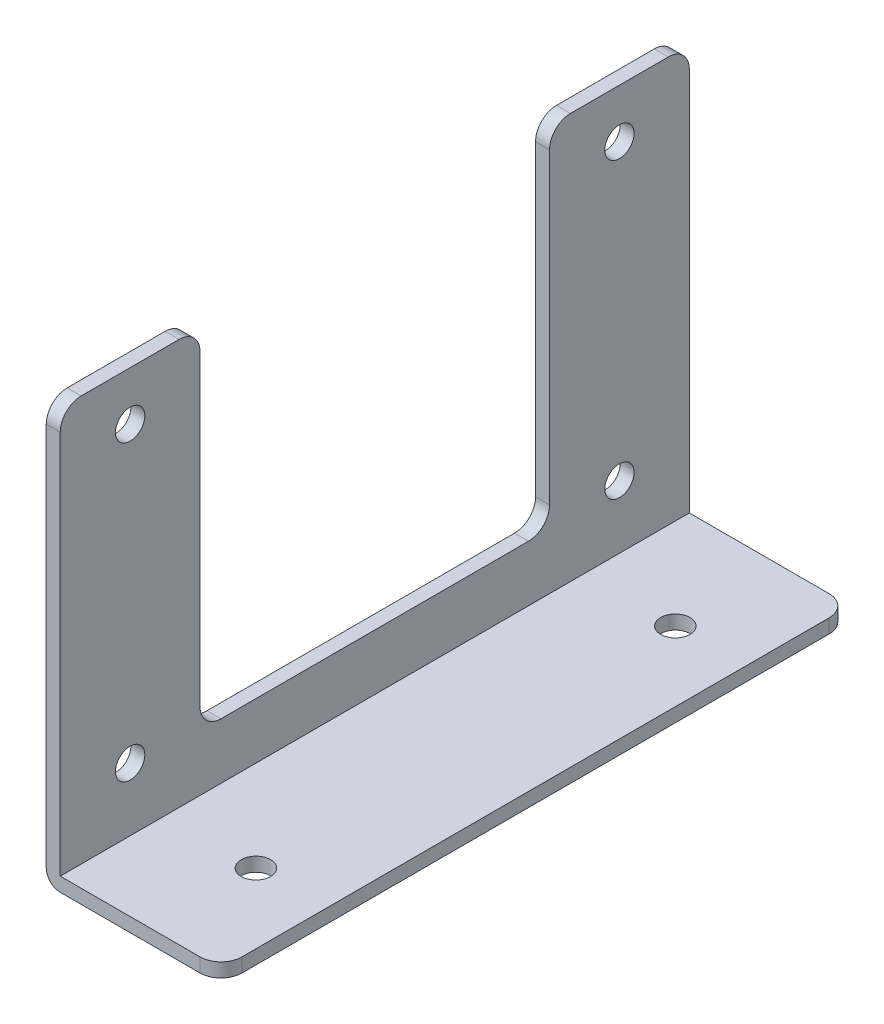
ISO-10303-21;
HEADER;
FILE_DESCRIPTION(('STEP AP214'),'2;1');
FILE_NAME('part.step','',(''),(''),'','','');
FILE_SCHEMA(('AUTOMOTIVE_DESIGN { 1 0 10303 214 1 1 1 1 }'));
ENDSEC;
DATA;
#1=APPLICATION_CONTEXT('core data for automotive mechanical design processes');
#2=APPLICATION_PROTOCOL_DEFINITION('international standard','automotive_design',2000,#1);
#3=PRODUCT_CONTEXT('',#1,'mechanical');
#4=PRODUCT('Part','Part','',(#3));
#5=PRODUCT_RELATED_PRODUCT_CATEGORY('part','',(#4));
#6=PRODUCT_DEFINITION_FORMATION('','',#4);
#7=PRODUCT_DEFINITION_CONTEXT('part definition',#1,'design');
#8=PRODUCT_DEFINITION('design','',#6,#7);
#9=PRODUCT_DEFINITION_SHAPE('','',#8);
#10=(LENGTH_UNIT() NAMED_UNIT(*) SI_UNIT(.MILLI.,.METRE.));
#11=(NAMED_UNIT(*) PLANE_ANGLE_UNIT() SI_UNIT($,.RADIAN.));
#12=(NAMED_UNIT(*) SI_UNIT($,.STERADIAN.) SOLID_ANGLE_UNIT());
#13=UNCERTAINTY_MEASURE_WITH_UNIT(LENGTH_MEASURE(1.E-05),#10,'distance_accuracy_value','');
#14=(GEOMETRIC_REPRESENTATION_CONTEXT(3) GLOBAL_UNCERTAINTY_ASSIGNED_CONTEXT((#13)) GLOBAL_UNIT_ASSIGNED_CONTEXT((#10,
#11,#12)) REPRESENTATION_CONTEXT('',''));
#15=CARTESIAN_POINT('',(0.,0.,0.));
#16=DIRECTION('',(0.,0.,1.));
#17=DIRECTION('',(1.,0.,0.));
#18=AXIS2_PLACEMENT_3D('',#15,#16,#17);
#19=CARTESIAN_POINT('',(0.,-39.531388125356,45.));
#20=DIRECTION('',(1.,0.,0.));
#21=DIRECTION('',(0.,1.,0.));
#22=AXIS2_PLACEMENT_3D('',#19,#20,#21);
#23=PLANE('',#22);
#24=CARTESIAN_POINT('',(0.,-88.531388125356,35.));
#25=DIRECTION('',(1.,0.,0.));
#26=DIRECTION('',(0.,0.,-1.));
#27=AXIS2_PLACEMENT_3D('',#24,#25,#26);
#28=CIRCLE('',#27,2.1);
#29=CARTESIAN_POINT('',(0.,-88.531388125356,32.9));
#30=VERTEX_POINT('',#29);
#31=EDGE_CURVE('E204',#30,#30,#28,.T.);
#32=ORIENTED_EDGE('',*,*,#31,.T.);
#33=EDGE_LOOP('',(#32));
#34=FACE_BOUND('',#33,.T.);
#35=CARTESIAN_POINT('',(0.,-46.531388125356,35.));
#36=DIRECTION('',(1.,0.,0.));
#37=DIRECTION('',(0.,0.,-1.));
#38=AXIS2_PLACEMENT_3D('',#35,#36,#37);
#39=CIRCLE('',#38,2.1);
#40=CARTESIAN_POINT('',(0.,-46.531388125356,32.9));
#41=VERTEX_POINT('',#40);
#42=EDGE_CURVE('E459',#41,#41,#39,.T.);
#43=ORIENTED_EDGE('',*,*,#42,.T.);
#44=EDGE_LOOP('',(#43));
#45=FACE_BOUND('',#44,.T.);
#46=CARTESIAN_POINT('',(0.,-88.531388125356,-35.));
#47=DIRECTION('',(1.,0.,0.));
#48=DIRECTION('',(0.,0.,1.));
#49=AXIS2_PLACEMENT_3D('',#46,#47,#48);
#50=CIRCLE('',#49,2.1);
#51=CARTESIAN_POINT('',(0.,-88.531388125356,-32.9));
#52=VERTEX_POINT('',#51);
#53=EDGE_CURVE('E462',#52,#52,#50,.T.);
#54=ORIENTED_EDGE('',*,*,#53,.T.);
#55=EDGE_LOOP('',(#54));
#56=FACE_BOUND('',#55,.T.);
#57=CARTESIAN_POINT('',(0.,-46.531388125356,-35.));
#58=DIRECTION('',(1.,0.,0.));
#59=DIRECTION('',(0.,0.,1.));
#60=AXIS2_PLACEMENT_3D('',#57,#58,#59);
#61=CIRCLE('',#60,2.1);
#62=CARTESIAN_POINT('',(0.,-46.531388125356,-32.9));
#63=VERTEX_POINT('',#62);
#64=EDGE_CURVE('E217',#63,#63,#61,.T.);
#65=ORIENTED_EDGE('',*,*,#64,.T.);
#66=EDGE_LOOP('',(#65));
#67=FACE_BOUND('',#66,.T.);
#68=DIRECTION('',(0.,1.,0.));
#69=VECTOR('',#68,1.);
#70=CARTESIAN_POINT('',(0.,-39.531388125356,-25.));
#71=LINE('',#70,#69);
#72=CARTESIAN_POINT('',(0.,-86.531388125356,-25.));
#73=VERTEX_POINT('',#72);
#74=CARTESIAN_POINT('',(0.,-42.531388125356,-25.));
#75=VERTEX_POINT('',#74);
#76=EDGE_CURVE('E287',#73,#75,#71,.T.);
#77=ORIENTED_EDGE('',*,*,#76,.T.);
#78=CARTESIAN_POINT('',(0.,-42.531388125356,-28.));
#79=DIRECTION('',(1.,0.,0.));
#80=DIRECTION('',(0.,1.,0.));
#81=AXIS2_PLACEMENT_3D('',#78,#79,#80);
#82=CIRCLE('',#81,3.);
#83=CARTESIAN_POINT('',(0.,-39.531388125356,-28.));
#84=VERTEX_POINT('',#83);
#85=EDGE_CURVE('E233',#75,#84,#82,.F.);
#86=ORIENTED_EDGE('',*,*,#85,.T.);
#87=DIRECTION('',(0.,0.,-1.));
#88=VECTOR('',#87,1.);
#89=CARTESIAN_POINT('',(0.,-39.531388125356,45.));
#90=LINE('',#89,#88);
#91=CARTESIAN_POINT('',(0.,-39.531388125356,-42.));
#92=VERTEX_POINT('',#91);
#93=EDGE_CURVE('E330',#84,#92,#90,.T.);
#94=ORIENTED_EDGE('',*,*,#93,.T.);
#95=CARTESIAN_POINT('',(0.,-42.531388125356,-42.));
#96=DIRECTION('',(1.,0.,0.));
#97=DIRECTION('',(0.,1.,0.));
#98=AXIS2_PLACEMENT_3D('',#95,#96,#97);
#99=CIRCLE('',#98,3.);
#100=CARTESIAN_POINT('',(0.,-42.531388125356,-45.));
#101=VERTEX_POINT('',#100);
#102=EDGE_CURVE('E229',#92,#101,#99,.F.);
#103=ORIENTED_EDGE('',*,*,#102,.T.);
#104=DIRECTION('',(0.,-1.,0.));
#105=VECTOR('',#104,1.);
#106=CARTESIAN_POINT('',(0.,-39.531388125356,-45.));
#107=LINE('',#106,#105);
#108=CARTESIAN_POINT('',(0.,-97.531388125356,-45.));
#109=VERTEX_POINT('',#108);
#110=EDGE_CURVE('E189',#101,#109,#107,.T.);
#111=ORIENTED_EDGE('',*,*,#110,.T.);
#112=DIRECTION('',(0.,0.,-1.));
#113=VECTOR('',#112,1.);
#114=CARTESIAN_POINT('',(0.,-97.531388125356,45.));
#115=LINE('',#114,#113);
#116=CARTESIAN_POINT('',(0.,-97.531388125356,45.));
#117=VERTEX_POINT('',#116);
#118=EDGE_CURVE('E182',#117,#109,#115,.T.);
#119=ORIENTED_EDGE('',*,*,#118,.F.);
#120=DIRECTION('',(0.,-1.,0.));
#121=VECTOR('',#120,1.);
#122=CARTESIAN_POINT('',(0.,-39.531388125356,45.));
#123=LINE('',#122,#121);
#124=CARTESIAN_POINT('',(0.,-42.531388125356,45.));
#125=VERTEX_POINT('',#124);
#126=EDGE_CURVE('E167',#125,#117,#123,.T.);
#127=ORIENTED_EDGE('',*,*,#126,.F.);
#128=CARTESIAN_POINT('',(0.,-42.531388125356,42.));
#129=DIRECTION('',(1.,0.,0.));
#130=DIRECTION('',(0.,1.,0.));
#131=AXIS2_PLACEMENT_3D('',#128,#129,#130);
#132=CIRCLE('',#131,3.);
#133=CARTESIAN_POINT('',(0.,-39.531388125356,42.));
#134=VERTEX_POINT('',#133);
#135=EDGE_CURVE('E227',#125,#134,#132,.F.);
#136=ORIENTED_EDGE('',*,*,#135,.T.);
#137=CARTESIAN_POINT('',(0.,-39.531388125356,28.));
#138=VERTEX_POINT('',#137);
#139=EDGE_CURVE('E339',#134,#138,#90,.T.);
#140=ORIENTED_EDGE('',*,*,#139,.T.);
#141=CARTESIAN_POINT('',(0.,-42.531388125356,28.));
#142=DIRECTION('',(1.,0.,0.));
#143=DIRECTION('',(0.,1.,0.));
#144=AXIS2_PLACEMENT_3D('',#141,#142,#143);
#145=CIRCLE('',#144,3.);
#146=CARTESIAN_POINT('',(0.,-42.531388125356,25.));
#147=VERTEX_POINT('',#146);
#148=EDGE_CURVE('E231',#138,#147,#145,.F.);
#149=ORIENTED_EDGE('',*,*,#148,.T.);
#150=DIRECTION('',(0.,-1.,0.));
#151=VECTOR('',#150,1.);
#152=CARTESIAN_POINT('',(0.,-39.531388125356,25.));
#153=LINE('',#152,#151);
#154=CARTESIAN_POINT('',(0.,-86.531388125356,25.));
#155=VERTEX_POINT('',#154);
#156=EDGE_CURVE('E213',#147,#155,#153,.T.);
#157=ORIENTED_EDGE('',*,*,#156,.T.);
#158=CARTESIAN_POINT('',(0.,-86.531388125356,22.));
#159=DIRECTION('',(1.,0.,0.));
#160=DIRECTION('',(0.,1.,0.));
#161=AXIS2_PLACEMENT_3D('',#158,#159,#160);
#162=CIRCLE('',#161,3.);
#163=CARTESIAN_POINT('',(0.,-89.531388125356,22.));
#164=VERTEX_POINT('',#163);
#165=EDGE_CURVE('E282',#155,#164,#162,.T.);
#166=ORIENTED_EDGE('',*,*,#165,.T.);
#167=DIRECTION('',(0.,0.,-1.));
#168=VECTOR('',#167,1.);
#169=CARTESIAN_POINT('',(0.,-89.531388125356,25.));
#170=LINE('',#169,#168);
#171=CARTESIAN_POINT('',(0.,-89.531388125356,-22.));
#172=VERTEX_POINT('',#171);
#173=EDGE_CURVE('E289',#164,#172,#170,.T.);
#174=ORIENTED_EDGE('',*,*,#173,.T.);
#175=CARTESIAN_POINT('',(0.,-86.531388125356,-22.));
#176=DIRECTION('',(1.,0.,0.));
#177=DIRECTION('',(0.,1.,0.));
#178=AXIS2_PLACEMENT_3D('',#175,#176,#177);
#179=CIRCLE('',#178,3.);
#180=EDGE_CURVE('E41',#172,#73,#179,.T.);
#181=ORIENTED_EDGE('',*,*,#180,.T.);
#182=EDGE_LOOP('',(#77,#86,#94,#103,#111,#119,#127,#136,#140,#149,#157,#166,#174,#181));
#183=FACE_BOUND('',#182,.T.);
#184=ADVANCED_FACE('F33',(#34,#45,#56,#67,#183),#23,.F.);
#185=CARTESIAN_POINT('',(2.,-39.531388125356,45.));
#186=DIRECTION('',(-1.,0.,0.));
#187=DIRECTION('',(0.,-1.,0.));
#188=AXIS2_PLACEMENT_3D('',#185,#186,#187);
#189=PLANE('',#188);
#190=CARTESIAN_POINT('',(2.,-88.531388125356,35.));
#191=DIRECTION('',(-1.,0.,0.));
#192=DIRECTION('',(0.,-1.,0.));
#193=AXIS2_PLACEMENT_3D('',#190,#191,#192);
#194=CIRCLE('',#193,2.1);
#195=CARTESIAN_POINT('',(2.,-90.631388125356,35.));
#196=VERTEX_POINT('',#195);
#197=EDGE_CURVE('E210',#196,#196,#194,.F.);
#198=ORIENTED_EDGE('',*,*,#197,.F.);
#199=EDGE_LOOP('',(#198));
#200=FACE_BOUND('',#199,.T.);
#201=CARTESIAN_POINT('',(1.99999999999999,-46.531388125356,35.));
#202=DIRECTION('',(-1.,0.,0.));
#203=DIRECTION('',(0.,-1.,0.));
#204=AXIS2_PLACEMENT_3D('',#201,#202,#203);
#205=CIRCLE('',#204,2.1);
#206=CARTESIAN_POINT('',(2.,-48.631388125356,35.));
#207=VERTEX_POINT('',#206);
#208=EDGE_CURVE('E207',#207,#207,#205,.F.);
#209=ORIENTED_EDGE('',*,*,#208,.F.);
#210=EDGE_LOOP('',(#209));
#211=FACE_BOUND('',#210,.T.);
#212=CARTESIAN_POINT('',(2.,-88.531388125356,-35.));
#213=DIRECTION('',(-1.,0.,0.));
#214=DIRECTION('',(0.,-1.,0.));
#215=AXIS2_PLACEMENT_3D('',#212,#213,#214);
#216=CIRCLE('',#215,2.1);
#217=CARTESIAN_POINT('',(2.,-90.631388125356,-35.));
#218=VERTEX_POINT('',#217);
#219=EDGE_CURVE('E203',#218,#218,#216,.F.);
#220=ORIENTED_EDGE('',*,*,#219,.F.);
#221=EDGE_LOOP('',(#220));
#222=FACE_BOUND('',#221,.T.);
#223=CARTESIAN_POINT('',(1.99999999999999,-46.531388125356,-35.));
#224=DIRECTION('',(-1.,0.,0.));
#225=DIRECTION('',(0.,-1.,0.));
#226=AXIS2_PLACEMENT_3D('',#223,#224,#225);
#227=CIRCLE('',#226,2.1);
#228=CARTESIAN_POINT('',(2.,-48.631388125356,-35.));
#229=VERTEX_POINT('',#228);
#230=EDGE_CURVE('E200',#229,#229,#227,.F.);
#231=ORIENTED_EDGE('',*,*,#230,.F.);
#232=EDGE_LOOP('',(#231));
#233=FACE_BOUND('',#232,.T.);
#234=DIRECTION('',(0.,0.,-1.));
#235=VECTOR('',#234,1.);
#236=CARTESIAN_POINT('',(2.,-39.531388125356,45.));
#237=LINE('',#236,#235);
#238=CARTESIAN_POINT('',(2.,-39.531388125356,-28.));
#239=VERTEX_POINT('',#238);
#240=CARTESIAN_POINT('',(2.,-39.531388125356,-42.));
#241=VERTEX_POINT('',#240);
#242=EDGE_CURVE('E342',#239,#241,#237,.T.);
#243=ORIENTED_EDGE('',*,*,#242,.F.);
#244=CARTESIAN_POINT('',(1.99999999999999,-42.531388125356,-28.));
#245=DIRECTION('',(-1.,0.,0.));
#246=DIRECTION('',(0.,-1.,0.));
#247=AXIS2_PLACEMENT_3D('',#244,#245,#246);
#248=CIRCLE('',#247,3.);
#249=CARTESIAN_POINT('',(2.,-42.531388125356,-25.));
#250=VERTEX_POINT('',#249);
#251=EDGE_CURVE('E246',#239,#250,#248,.F.);
#252=ORIENTED_EDGE('',*,*,#251,.T.);
#253=DIRECTION('',(0.,1.,0.));
#254=VECTOR('',#253,1.);
#255=CARTESIAN_POINT('',(2.,-39.531388125356,-25.));
#256=LINE('',#255,#254);
#257=CARTESIAN_POINT('',(2.,-86.531388125356,-25.));
#258=VERTEX_POINT('',#257);
#259=EDGE_CURVE('E298',#258,#250,#256,.T.);
#260=ORIENTED_EDGE('',*,*,#259,.F.);
#261=CARTESIAN_POINT('',(2.,-86.531388125356,-22.));
#262=DIRECTION('',(-1.,0.,0.));
#263=DIRECTION('',(0.,-1.,0.));
#264=AXIS2_PLACEMENT_3D('',#261,#262,#263);
#265=CIRCLE('',#264,3.);
#266=CARTESIAN_POINT('',(2.,-89.531388125356,-22.));
#267=VERTEX_POINT('',#266);
#268=EDGE_CURVE('E11',#258,#267,#265,.T.);
#269=ORIENTED_EDGE('',*,*,#268,.T.);
#270=DIRECTION('',(0.,0.,-1.));
#271=VECTOR('',#270,1.);
#272=CARTESIAN_POINT('',(2.,-89.531388125356,45.));
#273=LINE('',#272,#271);
#274=CARTESIAN_POINT('',(2.,-89.531388125356,22.));
#275=VERTEX_POINT('',#274);
#276=EDGE_CURVE('E191',#275,#267,#273,.T.);
#277=ORIENTED_EDGE('',*,*,#276,.F.);
#278=CARTESIAN_POINT('',(2.,-86.531388125356,22.));
#279=DIRECTION('',(-1.,0.,0.));
#280=DIRECTION('',(0.,-1.,0.));
#281=AXIS2_PLACEMENT_3D('',#278,#279,#280);
#282=CIRCLE('',#281,3.);
#283=CARTESIAN_POINT('',(2.,-86.531388125356,25.));
#284=VERTEX_POINT('',#283);
#285=EDGE_CURVE('E284',#275,#284,#282,.T.);
#286=ORIENTED_EDGE('',*,*,#285,.T.);
#287=DIRECTION('',(0.,-1.,0.));
#288=VECTOR('',#287,1.);
#289=CARTESIAN_POINT('',(2.,-39.531388125356,25.));
#290=LINE('',#289,#288);
#291=CARTESIAN_POINT('',(2.,-42.531388125356,25.));
#292=VERTEX_POINT('',#291);
#293=EDGE_CURVE('E315',#292,#284,#290,.T.);
#294=ORIENTED_EDGE('',*,*,#293,.F.);
#295=CARTESIAN_POINT('',(1.99999999999999,-42.531388125356,28.));
#296=DIRECTION('',(-1.,0.,0.));
#297=DIRECTION('',(0.,-1.,0.));
#298=AXIS2_PLACEMENT_3D('',#295,#296,#297);
#299=CIRCLE('',#298,3.);
#300=CARTESIAN_POINT('',(2.,-39.531388125356,28.));
#301=VERTEX_POINT('',#300);
#302=EDGE_CURVE('E244',#292,#301,#299,.F.);
#303=ORIENTED_EDGE('',*,*,#302,.T.);
#304=CARTESIAN_POINT('',(2.,-39.531388125356,42.));
#305=VERTEX_POINT('',#304);
#306=EDGE_CURVE('E343',#305,#301,#237,.T.);
#307=ORIENTED_EDGE('',*,*,#306,.F.);
#308=CARTESIAN_POINT('',(2.,-42.531388125356,42.));
#309=DIRECTION('',(-1.,0.,0.));
#310=DIRECTION('',(0.,-1.,0.));
#311=AXIS2_PLACEMENT_3D('',#308,#309,#310);
#312=CIRCLE('',#311,3.);
#313=CARTESIAN_POINT('',(2.,-42.531388125356,45.));
#314=VERTEX_POINT('',#313);
#315=EDGE_CURVE('E240',#305,#314,#312,.F.);
#316=ORIENTED_EDGE('',*,*,#315,.T.);
#317=DIRECTION('',(0.,1.,0.));
#318=VECTOR('',#317,1.);
#319=CARTESIAN_POINT('',(2.,-39.531388125356,45.));
#320=LINE('',#319,#318);
#321=CARTESIAN_POINT('',(2.,-97.531388125356,45.));
#322=VERTEX_POINT('',#321);
#323=EDGE_CURVE('E329',#322,#314,#320,.T.);
#324=ORIENTED_EDGE('',*,*,#323,.F.);
#325=DIRECTION('',(0.,0.,-1.));
#326=VECTOR('',#325,1.);
#327=CARTESIAN_POINT('',(2.,-97.531388125356,45.));
#328=LINE('',#327,#326);
#329=CARTESIAN_POINT('',(2.,-97.531388125356,-45.));
#330=VERTEX_POINT('',#329);
#331=EDGE_CURVE('E346',#322,#330,#328,.T.);
#332=ORIENTED_EDGE('',*,*,#331,.T.);
#333=DIRECTION('',(0.,1.,0.));
#334=VECTOR('',#333,1.);
#335=CARTESIAN_POINT('',(2.,-39.531388125356,-45.));
#336=LINE('',#335,#334);
#337=CARTESIAN_POINT('',(2.,-42.531388125356,-45.));
#338=VERTEX_POINT('',#337);
#339=EDGE_CURVE('E177',#330,#338,#336,.T.);
#340=ORIENTED_EDGE('',*,*,#339,.T.);
#341=CARTESIAN_POINT('',(2.,-42.531388125356,-42.));
#342=DIRECTION('',(-1.,0.,0.));
#343=DIRECTION('',(0.,-1.,0.));
#344=AXIS2_PLACEMENT_3D('',#341,#342,#343);
#345=CIRCLE('',#344,3.);
#346=EDGE_CURVE('E242',#338,#241,#345,.F.);
#347=ORIENTED_EDGE('',*,*,#346,.T.);
#348=EDGE_LOOP('',(#243,#252,#260,#269,#277,#286,#294,#303,#307,#316,#324,#332,#340,#347));
#349=FACE_BOUND('',#348,.T.);
#350=ADVANCED_FACE('F305',(#200,#211,#222,#233,#349),#189,.F.);
#351=CARTESIAN_POINT('',(0.,-39.531388125356,45.));
#352=DIRECTION('',(0.,-1.,0.));
#353=DIRECTION('',(0.,0.,-1.));
#354=AXIS2_PLACEMENT_3D('',#351,#352,#353);
#355=PLANE('',#354);
#356=ORIENTED_EDGE('',*,*,#306,.T.);
#357=DIRECTION('',(1.,0.,0.));
#358=VECTOR('',#357,1.);
#359=CARTESIAN_POINT('',(0.,-39.531388125356,28.));
#360=LINE('',#359,#358);
#361=EDGE_CURVE('E256',#301,#138,#360,.F.);
#362=ORIENTED_EDGE('',*,*,#361,.T.);
#363=ORIENTED_EDGE('',*,*,#139,.F.);
#364=DIRECTION('',(-1.,0.,0.));
#365=VECTOR('',#364,1.);
#366=CARTESIAN_POINT('',(2.,-39.531388125356,42.));
#367=LINE('',#366,#365);
#368=EDGE_CURVE('E254',#134,#305,#367,.F.);
#369=ORIENTED_EDGE('',*,*,#368,.T.);
#370=EDGE_LOOP('',(#356,#362,#363,#369));
#371=FACE_BOUND('',#370,.T.);
#372=ADVANCED_FACE('F399',(#371),#355,.F.);
#373=ORIENTED_EDGE('',*,*,#93,.F.);
#374=DIRECTION('',(-1.,0.,0.));
#375=VECTOR('',#374,1.);
#376=CARTESIAN_POINT('',(1.99999999999999,-39.531388125356,-28.));
#377=LINE('',#376,#375);
#378=EDGE_CURVE('E238',#84,#239,#377,.F.);
#379=ORIENTED_EDGE('',*,*,#378,.T.);
#380=ORIENTED_EDGE('',*,*,#242,.T.);
#381=DIRECTION('',(-1.,0.,0.));
#382=VECTOR('',#381,1.);
#383=CARTESIAN_POINT('',(0.,-39.531388125356,-42.));
#384=LINE('',#383,#382);
#385=EDGE_CURVE('E235',#241,#92,#384,.T.);
#386=ORIENTED_EDGE('',*,*,#385,.T.);
#387=EDGE_LOOP('',(#373,#379,#380,#386));
#388=FACE_BOUND('',#387,.T.);
#389=ADVANCED_FACE('F375',(#388),#355,.F.);
#390=CARTESIAN_POINT('',(2.,-97.531388125356,45.));
#391=DIRECTION('',(0.,0.,-1.));
#392=DIRECTION('',(-1.,0.,0.));
#393=AXIS2_PLACEMENT_3D('',#390,#391,#392);
#394=CYLINDRICAL_SURFACE('',#393,2.);
#395=CARTESIAN_POINT('',(2.,-97.531388125356,-45.));
#396=DIRECTION('',(0.,0.,1.));
#397=DIRECTION('',(1.,0.,0.));
#398=AXIS2_PLACEMENT_3D('',#395,#396,#397);
#399=CIRCLE('',#398,2.);
#400=CARTESIAN_POINT('',(2.00000000000002,-99.531388125356,-45.));
#401=VERTEX_POINT('',#400);
#402=EDGE_CURVE('E322',#109,#401,#399,.T.);
#403=ORIENTED_EDGE('',*,*,#402,.T.);
#404=DIRECTION('',(0.,0.,-1.));
#405=VECTOR('',#404,1.);
#406=CARTESIAN_POINT('',(2.00000000000002,-99.531388125356,45.));
#407=LINE('',#406,#405);
#408=CARTESIAN_POINT('',(2.00000000000002,-99.531388125356,45.));
#409=VERTEX_POINT('',#408);
#410=EDGE_CURVE('E184',#409,#401,#407,.T.);
#411=ORIENTED_EDGE('',*,*,#410,.F.);
#412=CARTESIAN_POINT('',(2.,-97.531388125356,45.));
#413=DIRECTION('',(0.,0.,1.));
#414=DIRECTION('',(1.,0.,0.));
#415=AXIS2_PLACEMENT_3D('',#412,#413,#414);
#416=CIRCLE('',#415,2.);
#417=EDGE_CURVE('E171',#117,#409,#416,.T.);
#418=ORIENTED_EDGE('',*,*,#417,.F.);
#419=ORIENTED_EDGE('',*,*,#118,.T.);
#420=EDGE_LOOP('',(#403,#411,#418,#419));
#421=FACE_BOUND('',#420,.T.);
#422=ADVANCED_FACE('F181',(#421),#394,.T.);
#423=CARTESIAN_POINT('',(2.00000000000002,-99.531388125356,45.));
#424=DIRECTION('',(0.,1.,0.));
#425=DIRECTION('',(0.,0.,1.));
#426=AXIS2_PLACEMENT_3D('',#423,#424,#425);
#427=PLANE('',#426);
#428=CARTESIAN_POINT('',(15.,-99.531388125356,30.));
#429=DIRECTION('',(0.,1.,0.));
#430=DIRECTION('',(0.,0.,1.));
#431=AXIS2_PLACEMENT_3D('',#428,#429,#430);
#432=CIRCLE('',#431,2.1);
#433=CARTESIAN_POINT('',(15.,-99.531388125356,32.1));
#434=VERTEX_POINT('',#433);
#435=EDGE_CURVE('E222',#434,#434,#432,.T.);
#436=ORIENTED_EDGE('',*,*,#435,.T.);
#437=EDGE_LOOP('',(#436));
#438=FACE_BOUND('',#437,.T.);
#439=CARTESIAN_POINT('',(15.,-99.531388125356,-30.));
#440=DIRECTION('',(0.,1.,0.));
#441=DIRECTION('',(0.,0.,1.));
#442=AXIS2_PLACEMENT_3D('',#439,#440,#441);
#443=CIRCLE('',#442,2.1);
#444=CARTESIAN_POINT('',(15.,-99.531388125356,-27.9));
#445=VERTEX_POINT('',#444);
#446=EDGE_CURVE('E218',#445,#445,#443,.T.);
#447=ORIENTED_EDGE('',*,*,#446,.T.);
#448=EDGE_LOOP('',(#447));
#449=FACE_BOUND('',#448,.T.);
#450=DIRECTION('',(1.,0.,0.));
#451=VECTOR('',#450,1.);
#452=CARTESIAN_POINT('',(2.00000000000002,-99.531388125356,-45.));
#453=LINE('',#452,#451);
#454=CARTESIAN_POINT('',(22.,-99.531388125356,-45.));
#455=VERTEX_POINT('',#454);
#456=EDGE_CURVE('E333',#401,#455,#453,.T.);
#457=ORIENTED_EDGE('',*,*,#456,.T.);
#458=CARTESIAN_POINT('',(22.,-99.531388125356,-42.));
#459=DIRECTION('',(0.,1.,0.));
#460=DIRECTION('',(0.,0.,1.));
#461=AXIS2_PLACEMENT_3D('',#458,#459,#460);
#462=CIRCLE('',#461,3.);
#463=CARTESIAN_POINT('',(25.,-99.531388125356,-42.));
#464=VERTEX_POINT('',#463);
#465=EDGE_CURVE('E276',#455,#464,#462,.F.);
#466=ORIENTED_EDGE('',*,*,#465,.T.);
#467=DIRECTION('',(0.,0.,-1.));
#468=VECTOR('',#467,1.);
#469=CARTESIAN_POINT('',(25.,-99.531388125356,45.));
#470=LINE('',#469,#468);
#471=CARTESIAN_POINT('',(25.,-99.531388125356,42.));
#472=VERTEX_POINT('',#471);
#473=EDGE_CURVE('E196',#472,#464,#470,.T.);
#474=ORIENTED_EDGE('',*,*,#473,.F.);
#475=CARTESIAN_POINT('',(22.,-99.531388125356,42.));
#476=DIRECTION('',(0.,1.,0.));
#477=DIRECTION('',(0.,0.,1.));
#478=AXIS2_PLACEMENT_3D('',#475,#476,#477);
#479=CIRCLE('',#478,3.);
#480=CARTESIAN_POINT('',(22.,-99.531388125356,45.));
#481=VERTEX_POINT('',#480);
#482=EDGE_CURVE('E48',#472,#481,#479,.F.);
#483=ORIENTED_EDGE('',*,*,#482,.T.);
#484=DIRECTION('',(1.,0.,0.));
#485=VECTOR('',#484,1.);
#486=CARTESIAN_POINT('',(2.00000000000002,-99.531388125356,45.));
#487=LINE('',#486,#485);
#488=EDGE_CURVE('E185',#409,#481,#487,.T.);
#489=ORIENTED_EDGE('',*,*,#488,.F.);
#490=ORIENTED_EDGE('',*,*,#410,.T.);
#491=EDGE_LOOP('',(#457,#466,#474,#483,#489,#490));
#492=FACE_BOUND('',#491,.T.);
#493=ADVANCED_FACE('F407',(#438,#449,#492),#427,.F.);
#494=CARTESIAN_POINT('',(25.,-97.531388125356,45.));
#495=DIRECTION('',(-1.,0.,0.));
#496=DIRECTION('',(0.,-1.,0.));
#497=AXIS2_PLACEMENT_3D('',#494,#495,#496);
#498=PLANE('',#497);
#499=ORIENTED_EDGE('',*,*,#473,.T.);
#500=DIRECTION('',(0.,1.,0.));
#501=VECTOR('',#500,1.);
#502=CARTESIAN_POINT('',(25.,-97.531388125356,-42.));
#503=LINE('',#502,#501);
#504=CARTESIAN_POINT('',(25.,-97.531388125356,-42.));
#505=VERTEX_POINT('',#504);
#506=EDGE_CURVE('E265',#464,#505,#503,.T.);
#507=ORIENTED_EDGE('',*,*,#506,.T.);
#508=DIRECTION('',(0.,0.,-1.));
#509=VECTOR('',#508,1.);
#510=CARTESIAN_POINT('',(25.,-97.531388125356,45.));
#511=LINE('',#510,#509);
#512=CARTESIAN_POINT('',(25.,-97.531388125356,42.));
#513=VERTEX_POINT('',#512);
#514=EDGE_CURVE('E349',#513,#505,#511,.T.);
#515=ORIENTED_EDGE('',*,*,#514,.F.);
#516=DIRECTION('',(0.,1.,0.));
#517=VECTOR('',#516,1.);
#518=CARTESIAN_POINT('',(25.,-99.531388125356,42.));
#519=LINE('',#518,#517);
#520=EDGE_CURVE('E263',#513,#472,#519,.F.);
#521=ORIENTED_EDGE('',*,*,#520,.T.);
#522=EDGE_LOOP('',(#499,#507,#515,#521));
#523=FACE_BOUND('',#522,.T.);
#524=ADVANCED_FACE('F354',(#523),#498,.F.);
#525=CARTESIAN_POINT('',(2.,-97.531388125356,45.));
#526=DIRECTION('',(0.,-1.,0.));
#527=DIRECTION('',(0.,0.,-1.));
#528=AXIS2_PLACEMENT_3D('',#525,#526,#527);
#529=PLANE('',#528);
#530=CARTESIAN_POINT('',(15.,-97.531388125356,30.));
#531=DIRECTION('',(0.,-1.,0.));
#532=DIRECTION('',(0.,0.,-1.));
#533=AXIS2_PLACEMENT_3D('',#530,#531,#532);
#534=CIRCLE('',#533,2.1);
#535=CARTESIAN_POINT('',(15.,-97.531388125356,27.9));
#536=VERTEX_POINT('',#535);
#537=EDGE_CURVE('E219',#536,#536,#534,.T.);
#538=ORIENTED_EDGE('',*,*,#537,.T.);
#539=EDGE_LOOP('',(#538));
#540=FACE_BOUND('',#539,.T.);
#541=CARTESIAN_POINT('',(15.,-97.531388125356,-30.));
#542=DIRECTION('',(0.,-1.,0.));
#543=DIRECTION('',(0.,0.,-1.));
#544=AXIS2_PLACEMENT_3D('',#541,#542,#543);
#545=CIRCLE('',#544,2.1);
#546=CARTESIAN_POINT('',(15.,-97.531388125356,-32.1));
#547=VERTEX_POINT('',#546);
#548=EDGE_CURVE('E214',#547,#547,#545,.T.);
#549=ORIENTED_EDGE('',*,*,#548,.T.);
#550=EDGE_LOOP('',(#549));
#551=FACE_BOUND('',#550,.T.);
#552=ORIENTED_EDGE('',*,*,#514,.T.);
#553=CARTESIAN_POINT('',(22.,-97.531388125356,-42.));
#554=DIRECTION('',(0.,-1.,0.));
#555=DIRECTION('',(0.,0.,-1.));
#556=AXIS2_PLACEMENT_3D('',#553,#554,#555);
#557=CIRCLE('',#556,3.);
#558=CARTESIAN_POINT('',(22.,-97.531388125356,-45.));
#559=VERTEX_POINT('',#558);
#560=EDGE_CURVE('E270',#505,#559,#557,.F.);
#561=ORIENTED_EDGE('',*,*,#560,.T.);
#562=DIRECTION('',(-1.,0.,0.));
#563=VECTOR('',#562,1.);
#564=CARTESIAN_POINT('',(2.,-97.531388125356,-45.));
#565=LINE('',#564,#563);
#566=EDGE_CURVE('E335',#559,#330,#565,.T.);
#567=ORIENTED_EDGE('',*,*,#566,.T.);
#568=ORIENTED_EDGE('',*,*,#331,.F.);
#569=DIRECTION('',(-1.,0.,0.));
#570=VECTOR('',#569,1.);
#571=CARTESIAN_POINT('',(2.,-97.531388125356,45.));
#572=LINE('',#571,#570);
#573=CARTESIAN_POINT('',(22.,-97.531388125356,45.));
#574=VERTEX_POINT('',#573);
#575=EDGE_CURVE('E327',#574,#322,#572,.T.);
#576=ORIENTED_EDGE('',*,*,#575,.F.);
#577=CARTESIAN_POINT('',(22.,-97.531388125356,42.));
#578=DIRECTION('',(0.,-1.,0.));
#579=DIRECTION('',(0.,0.,-1.));
#580=AXIS2_PLACEMENT_3D('',#577,#578,#579);
#581=CIRCLE('',#580,3.);
#582=EDGE_CURVE('E268',#574,#513,#581,.F.);
#583=ORIENTED_EDGE('',*,*,#582,.T.);
#584=EDGE_LOOP('',(#552,#561,#567,#568,#576,#583));
#585=FACE_BOUND('',#584,.T.);
#586=ADVANCED_FACE('F361',(#540,#551,#585),#529,.F.);
#587=CARTESIAN_POINT('',(2.,-97.531388125356,45.));
#588=DIRECTION('',(0.,0.,1.));
#589=DIRECTION('',(1.,0.,0.));
#590=AXIS2_PLACEMENT_3D('',#587,#588,#589);
#591=PLANE('',#590);
#592=ORIENTED_EDGE('',*,*,#323,.T.);
#593=DIRECTION('',(-1.,0.,0.));
#594=VECTOR('',#593,1.);
#595=CARTESIAN_POINT('',(0.,-42.531388125356,45.));
#596=LINE('',#595,#594);
#597=EDGE_CURVE('E174',#314,#125,#596,.T.);
#598=ORIENTED_EDGE('',*,*,#597,.T.);
#599=ORIENTED_EDGE('',*,*,#126,.T.);
#600=ORIENTED_EDGE('',*,*,#417,.T.);
#601=ORIENTED_EDGE('',*,*,#488,.T.);
#602=DIRECTION('',(0.,1.,0.));
#603=VECTOR('',#602,1.);
#604=CARTESIAN_POINT('',(22.,-97.531388125356,45.));
#605=LINE('',#604,#603);
#606=EDGE_CURVE('E278',#481,#574,#605,.T.);
#607=ORIENTED_EDGE('',*,*,#606,.T.);
#608=ORIENTED_EDGE('',*,*,#575,.T.);
#609=EDGE_LOOP('',(#592,#598,#599,#600,#601,#607,#608));
#610=FACE_BOUND('',#609,.T.);
#611=ADVANCED_FACE('F170',(#610),#591,.T.);
#612=CARTESIAN_POINT('',(2.,-97.531388125356,-45.));
#613=DIRECTION('',(0.,0.,1.));
#614=DIRECTION('',(1.,0.,0.));
#615=AXIS2_PLACEMENT_3D('',#612,#613,#614);
#616=PLANE('',#615);
#617=ORIENTED_EDGE('',*,*,#566,.F.);
#618=DIRECTION('',(0.,1.,0.));
#619=VECTOR('',#618,1.);
#620=CARTESIAN_POINT('',(22.,-97.531388125356,-45.));
#621=LINE('',#620,#619);
#622=EDGE_CURVE('E56',#559,#455,#621,.F.);
#623=ORIENTED_EDGE('',*,*,#622,.T.);
#624=ORIENTED_EDGE('',*,*,#456,.F.);
#625=ORIENTED_EDGE('',*,*,#402,.F.);
#626=ORIENTED_EDGE('',*,*,#110,.F.);
#627=DIRECTION('',(-1.,0.,0.));
#628=VECTOR('',#627,1.);
#629=CARTESIAN_POINT('',(2.,-42.531388125356,-45.));
#630=LINE('',#629,#628);
#631=EDGE_CURVE('E272',#101,#338,#630,.F.);
#632=ORIENTED_EDGE('',*,*,#631,.T.);
#633=ORIENTED_EDGE('',*,*,#339,.F.);
#634=EDGE_LOOP('',(#617,#623,#624,#625,#626,#632,#633));
#635=FACE_BOUND('',#634,.T.);
#636=ADVANCED_FACE('F364',(#635),#616,.F.);
#637=CARTESIAN_POINT('',(25.,-89.531388125356,25.));
#638=DIRECTION('',(0.,1.,0.));
#639=DIRECTION('',(0.,0.,1.));
#640=AXIS2_PLACEMENT_3D('',#637,#638,#639);
#641=PLANE('',#640);
#642=ORIENTED_EDGE('',*,*,#173,.F.);
#643=DIRECTION('',(-1.,0.,0.));
#644=VECTOR('',#643,1.);
#645=CARTESIAN_POINT('',(2.,-89.531388125356,22.));
#646=LINE('',#645,#644);
#647=EDGE_CURVE('E261',#164,#275,#646,.F.);
#648=ORIENTED_EDGE('',*,*,#647,.T.);
#649=ORIENTED_EDGE('',*,*,#276,.T.);
#650=DIRECTION('',(-1.,0.,0.));
#651=VECTOR('',#650,1.);
#652=CARTESIAN_POINT('',(0.,-89.531388125356,-22.));
#653=LINE('',#652,#651);
#654=EDGE_CURVE('E258',#267,#172,#653,.T.);
#655=ORIENTED_EDGE('',*,*,#654,.T.);
#656=EDGE_LOOP('',(#642,#648,#649,#655));
#657=FACE_BOUND('',#656,.T.);
#658=ADVANCED_FACE('F308',(#657),#641,.T.);
#659=CARTESIAN_POINT('',(25.,-39.531388125356,25.));
#660=DIRECTION('',(0.,0.,-1.));
#661=DIRECTION('',(0.,1.,0.));
#662=AXIS2_PLACEMENT_3D('',#659,#660,#661);
#663=PLANE('',#662);
#664=ORIENTED_EDGE('',*,*,#156,.F.);
#665=DIRECTION('',(1.,0.,0.));
#666=VECTOR('',#665,1.);
#667=CARTESIAN_POINT('',(1.99999999999999,-42.531388125356,25.));
#668=LINE('',#667,#666);
#669=EDGE_CURVE('E251',#147,#292,#668,.T.);
#670=ORIENTED_EDGE('',*,*,#669,.T.);
#671=ORIENTED_EDGE('',*,*,#293,.T.);
#672=DIRECTION('',(-1.,0.,0.));
#673=VECTOR('',#672,1.);
#674=CARTESIAN_POINT('',(0.,-86.531388125356,25.));
#675=LINE('',#674,#673);
#676=EDGE_CURVE('E248',#284,#155,#675,.T.);
#677=ORIENTED_EDGE('',*,*,#676,.T.);
#678=EDGE_LOOP('',(#664,#670,#671,#677));
#679=FACE_BOUND('',#678,.T.);
#680=ADVANCED_FACE('F318',(#679),#663,.T.);
#681=CARTESIAN_POINT('',(25.,-39.531388125356,-25.));
#682=DIRECTION('',(0.,0.,1.));
#683=DIRECTION('',(0.,-1.,0.));
#684=AXIS2_PLACEMENT_3D('',#681,#682,#683);
#685=PLANE('',#684);
#686=ORIENTED_EDGE('',*,*,#259,.T.);
#687=DIRECTION('',(-1.,0.,0.));
#688=VECTOR('',#687,1.);
#689=CARTESIAN_POINT('',(0.,-42.531388125356,-25.));
#690=LINE('',#689,#688);
#691=EDGE_CURVE('E224',#250,#75,#690,.T.);
#692=ORIENTED_EDGE('',*,*,#691,.T.);
#693=ORIENTED_EDGE('',*,*,#76,.F.);
#694=DIRECTION('',(-1.,0.,0.));
#695=VECTOR('',#694,1.);
#696=CARTESIAN_POINT('',(2.,-86.531388125356,-25.));
#697=LINE('',#696,#695);
#698=EDGE_CURVE('E194',#73,#258,#697,.F.);
#699=ORIENTED_EDGE('',*,*,#698,.T.);
#700=EDGE_LOOP('',(#686,#692,#693,#699));
#701=FACE_BOUND('',#700,.T.);
#702=ADVANCED_FACE('F295',(#701),#685,.T.);
#703=CARTESIAN_POINT('',(25.,-46.531388125356,-35.));
#704=DIRECTION('',(-1.,0.,0.));
#705=DIRECTION('',(0.,0.,1.));
#706=AXIS2_PLACEMENT_3D('',#703,#704,#705);
#707=CYLINDRICAL_SURFACE('',#706,2.1);
#708=ORIENTED_EDGE('',*,*,#64,.F.);
#709=EDGE_LOOP('',(#708));
#710=FACE_BOUND('',#709,.T.);
#711=ORIENTED_EDGE('',*,*,#230,.T.);
#712=EDGE_LOOP('',(#711));
#713=FACE_BOUND('',#712,.T.);
#714=ADVANCED_FACE('F429',(#710,#713),#707,.F.);
#715=CARTESIAN_POINT('',(25.,-88.531388125356,-35.));
#716=DIRECTION('',(-1.,0.,0.));
#717=DIRECTION('',(0.,0.,1.));
#718=AXIS2_PLACEMENT_3D('',#715,#716,#717);
#719=CYLINDRICAL_SURFACE('',#718,2.1);
#720=ORIENTED_EDGE('',*,*,#53,.F.);
#721=EDGE_LOOP('',(#720));
#722=FACE_BOUND('',#721,.T.);
#723=ORIENTED_EDGE('',*,*,#219,.T.);
#724=EDGE_LOOP('',(#723));
#725=FACE_BOUND('',#724,.T.);
#726=ADVANCED_FACE('F432',(#722,#725),#719,.F.);
#727=CARTESIAN_POINT('',(25.,-46.531388125356,35.));
#728=DIRECTION('',(-1.,0.,0.));
#729=DIRECTION('',(0.,0.,1.));
#730=AXIS2_PLACEMENT_3D('',#727,#728,#729);
#731=CYLINDRICAL_SURFACE('',#730,2.1);
#732=ORIENTED_EDGE('',*,*,#42,.F.);
#733=EDGE_LOOP('',(#732));
#734=FACE_BOUND('',#733,.T.);
#735=ORIENTED_EDGE('',*,*,#208,.T.);
#736=EDGE_LOOP('',(#735));
#737=FACE_BOUND('',#736,.T.);
#738=ADVANCED_FACE('F436',(#734,#737),#731,.F.);
#739=CARTESIAN_POINT('',(25.,-88.531388125356,35.));
#740=DIRECTION('',(-1.,0.,0.));
#741=DIRECTION('',(0.,0.,1.));
#742=AXIS2_PLACEMENT_3D('',#739,#740,#741);
#743=CYLINDRICAL_SURFACE('',#742,2.1);
#744=ORIENTED_EDGE('',*,*,#31,.F.);
#745=EDGE_LOOP('',(#744));
#746=FACE_BOUND('',#745,.T.);
#747=ORIENTED_EDGE('',*,*,#197,.T.);
#748=EDGE_LOOP('',(#747));
#749=FACE_BOUND('',#748,.T.);
#750=ADVANCED_FACE('F440',(#746,#749),#743,.F.);
#751=CARTESIAN_POINT('',(15.,-99.531388125356,-30.));
#752=DIRECTION('',(0.,1.,0.));
#753=DIRECTION('',(0.,0.,1.));
#754=AXIS2_PLACEMENT_3D('',#751,#752,#753);
#755=CYLINDRICAL_SURFACE('',#754,2.1);
#756=ORIENTED_EDGE('',*,*,#446,.F.);
#757=EDGE_LOOP('',(#756));
#758=FACE_BOUND('',#757,.T.);
#759=ORIENTED_EDGE('',*,*,#548,.F.);
#760=EDGE_LOOP('',(#759));
#761=FACE_BOUND('',#760,.T.);
#762=ADVANCED_FACE('F390',(#758,#761),#755,.F.);
#763=CARTESIAN_POINT('',(15.,-99.531388125356,30.));
#764=DIRECTION('',(0.,1.,0.));
#765=DIRECTION('',(0.,0.,1.));
#766=AXIS2_PLACEMENT_3D('',#763,#764,#765);
#767=CYLINDRICAL_SURFACE('',#766,2.1);
#768=ORIENTED_EDGE('',*,*,#435,.F.);
#769=EDGE_LOOP('',(#768));
#770=FACE_BOUND('',#769,.T.);
#771=ORIENTED_EDGE('',*,*,#537,.F.);
#772=EDGE_LOOP('',(#771));
#773=FACE_BOUND('',#772,.T.);
#774=ADVANCED_FACE('F382',(#770,#773),#767,.F.);
#775=CARTESIAN_POINT('',(25.,-42.531388125356,-28.));
#776=DIRECTION('',(1.,0.,0.));
#777=DIRECTION('',(0.,0.,-1.));
#778=AXIS2_PLACEMENT_3D('',#775,#776,#777);
#779=CYLINDRICAL_SURFACE('',#778,3.);
#780=ORIENTED_EDGE('',*,*,#251,.F.);
#781=ORIENTED_EDGE('',*,*,#378,.F.);
#782=ORIENTED_EDGE('',*,*,#85,.F.);
#783=ORIENTED_EDGE('',*,*,#691,.F.);
#784=EDGE_LOOP('',(#780,#781,#782,#783));
#785=FACE_BOUND('',#784,.T.);
#786=ADVANCED_FACE('F379',(#785),#779,.T.);
#787=CARTESIAN_POINT('',(25.,-42.531388125356,28.));
#788=DIRECTION('',(-1.,0.,0.));
#789=DIRECTION('',(0.,0.,1.));
#790=AXIS2_PLACEMENT_3D('',#787,#788,#789);
#791=CYLINDRICAL_SURFACE('',#790,3.);
#792=ORIENTED_EDGE('',*,*,#148,.F.);
#793=ORIENTED_EDGE('',*,*,#361,.F.);
#794=ORIENTED_EDGE('',*,*,#302,.F.);
#795=ORIENTED_EDGE('',*,*,#669,.F.);
#796=EDGE_LOOP('',(#792,#793,#794,#795));
#797=FACE_BOUND('',#796,.T.);
#798=ADVANCED_FACE('F381',(#797),#791,.T.);
#799=CARTESIAN_POINT('',(25.,-86.531388125356,22.));
#800=DIRECTION('',(1.,0.,0.));
#801=DIRECTION('',(0.,0.,-1.));
#802=AXIS2_PLACEMENT_3D('',#799,#800,#801);
#803=CYLINDRICAL_SURFACE('',#802,3.);
#804=ORIENTED_EDGE('',*,*,#285,.F.);
#805=ORIENTED_EDGE('',*,*,#647,.F.);
#806=ORIENTED_EDGE('',*,*,#165,.F.);
#807=ORIENTED_EDGE('',*,*,#676,.F.);
#808=EDGE_LOOP('',(#804,#805,#806,#807));
#809=FACE_BOUND('',#808,.T.);
#810=ADVANCED_FACE('F311',(#809),#803,.F.);
#811=CARTESIAN_POINT('',(25.,-86.531388125356,-22.));
#812=DIRECTION('',(1.,0.,0.));
#813=DIRECTION('',(0.,0.,-1.));
#814=AXIS2_PLACEMENT_3D('',#811,#812,#813);
#815=CYLINDRICAL_SURFACE('',#814,3.);
#816=ORIENTED_EDGE('',*,*,#268,.F.);
#817=ORIENTED_EDGE('',*,*,#698,.F.);
#818=ORIENTED_EDGE('',*,*,#180,.F.);
#819=ORIENTED_EDGE('',*,*,#654,.F.);
#820=EDGE_LOOP('',(#816,#817,#818,#819));
#821=FACE_BOUND('',#820,.T.);
#822=ADVANCED_FACE('F301',(#821),#815,.F.);
#823=CARTESIAN_POINT('',(22.,-97.531388125356,-42.));
#824=DIRECTION('',(0.,1.,0.));
#825=DIRECTION('',(-1.,0.,0.));
#826=AXIS2_PLACEMENT_3D('',#823,#824,#825);
#827=CYLINDRICAL_SURFACE('',#826,3.);
#828=ORIENTED_EDGE('',*,*,#465,.F.);
#829=ORIENTED_EDGE('',*,*,#622,.F.);
#830=ORIENTED_EDGE('',*,*,#560,.F.);
#831=ORIENTED_EDGE('',*,*,#506,.F.);
#832=EDGE_LOOP('',(#828,#829,#830,#831));
#833=FACE_BOUND('',#832,.T.);
#834=ADVANCED_FACE('F359',(#833),#827,.T.);
#835=CARTESIAN_POINT('',(0.,-42.531388125356,-42.));
#836=DIRECTION('',(-1.,0.,0.));
#837=DIRECTION('',(0.,0.,1.));
#838=AXIS2_PLACEMENT_3D('',#835,#836,#837);
#839=CYLINDRICAL_SURFACE('',#838,3.);
#840=ORIENTED_EDGE('',*,*,#346,.F.);
#841=ORIENTED_EDGE('',*,*,#631,.F.);
#842=ORIENTED_EDGE('',*,*,#102,.F.);
#843=ORIENTED_EDGE('',*,*,#385,.F.);
#844=EDGE_LOOP('',(#840,#841,#842,#843));
#845=FACE_BOUND('',#844,.T.);
#846=ADVANCED_FACE('F371',(#845),#839,.T.);
#847=CARTESIAN_POINT('',(2.,-42.531388125356,42.));
#848=DIRECTION('',(1.,0.,0.));
#849=DIRECTION('',(0.,0.,-1.));
#850=AXIS2_PLACEMENT_3D('',#847,#848,#849);
#851=CYLINDRICAL_SURFACE('',#850,3.);
#852=ORIENTED_EDGE('',*,*,#315,.F.);
#853=ORIENTED_EDGE('',*,*,#368,.F.);
#854=ORIENTED_EDGE('',*,*,#135,.F.);
#855=ORIENTED_EDGE('',*,*,#597,.F.);
#856=EDGE_LOOP('',(#852,#853,#854,#855));
#857=FACE_BOUND('',#856,.T.);
#858=ADVANCED_FACE('F475',(#857),#851,.T.);
#859=CARTESIAN_POINT('',(22.,-97.531388125356,42.));
#860=DIRECTION('',(0.,-1.,0.));
#861=DIRECTION('',(1.,0.,0.));
#862=AXIS2_PLACEMENT_3D('',#859,#860,#861);
#863=CYLINDRICAL_SURFACE('',#862,3.);
#864=ORIENTED_EDGE('',*,*,#482,.F.);
#865=ORIENTED_EDGE('',*,*,#520,.F.);
#866=ORIENTED_EDGE('',*,*,#582,.F.);
#867=ORIENTED_EDGE('',*,*,#606,.F.);
#868=EDGE_LOOP('',(#864,#865,#866,#867));
#869=FACE_BOUND('',#868,.T.);
#870=ADVANCED_FACE('F35',(#869),#863,.T.);
#871=CLOSED_SHELL('',(#184,#350,#372,#389,#422,#493,#524,#586,#611,#636,#658,#680,#702,#714,
#726,#738,#750,#762,#774,#786,#798,#810,#822,#834,#846,#858,#870));
#872=MANIFOLD_SOLID_BREP('B2',#871);
#873=ADVANCED_BREP_SHAPE_REPRESENTATION('',(#18,#872),#14);
#874=SHAPE_DEFINITION_REPRESENTATION(#9,#873);
ENDSEC;
END-ISO-10303-21;
